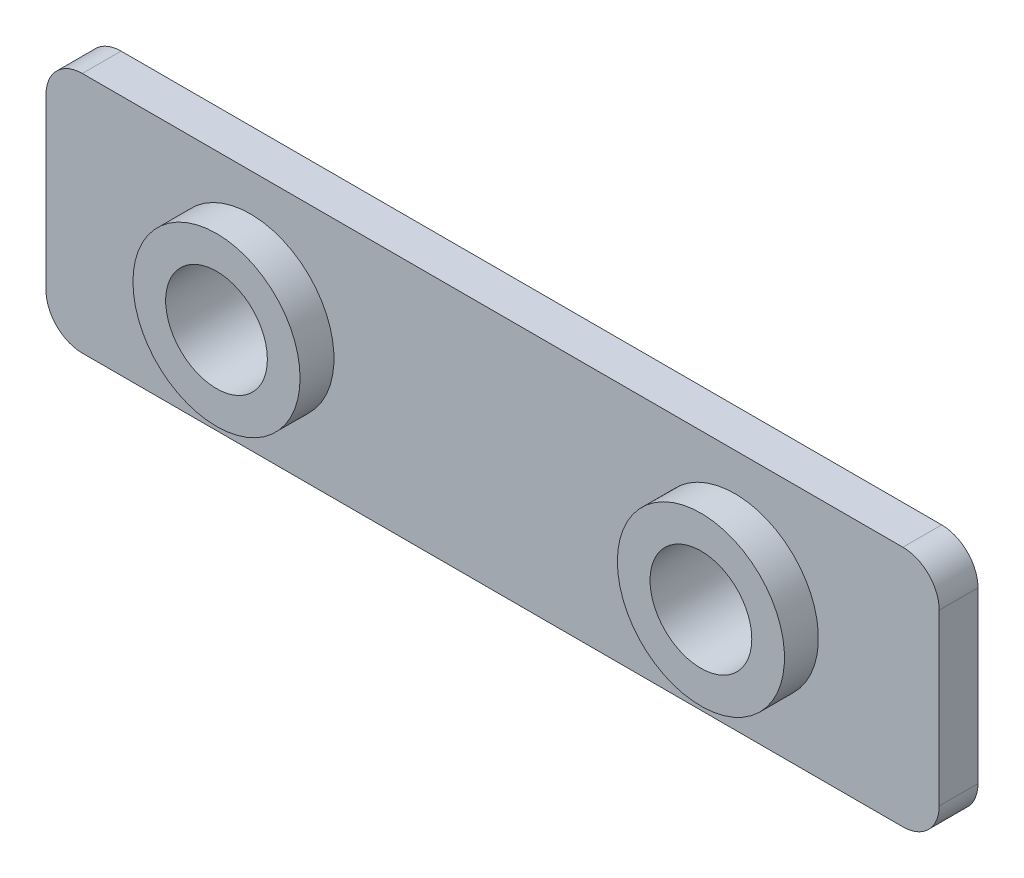
ISO-10303-21;
HEADER;
FILE_DESCRIPTION(('STEP AP214'),'2;1');
FILE_NAME('part.step','',(''),(''),'','','');
FILE_SCHEMA(('AUTOMOTIVE_DESIGN { 1 0 10303 214 1 1 1 1 }'));
ENDSEC;
DATA;
#1=APPLICATION_CONTEXT('core data for automotive mechanical design processes');
#2=APPLICATION_PROTOCOL_DEFINITION('international standard','automotive_design',2000,#1);
#3=PRODUCT_CONTEXT('',#1,'mechanical');
#4=PRODUCT('Part','Part','',(#3));
#5=PRODUCT_RELATED_PRODUCT_CATEGORY('part','',(#4));
#6=PRODUCT_DEFINITION_FORMATION('','',#4);
#7=PRODUCT_DEFINITION_CONTEXT('part definition',#1,'design');
#8=PRODUCT_DEFINITION('design','',#6,#7);
#9=PRODUCT_DEFINITION_SHAPE('','',#8);
#10=(LENGTH_UNIT() NAMED_UNIT(*) SI_UNIT(.MILLI.,.METRE.));
#11=(NAMED_UNIT(*) PLANE_ANGLE_UNIT() SI_UNIT($,.RADIAN.));
#12=(NAMED_UNIT(*) SI_UNIT($,.STERADIAN.) SOLID_ANGLE_UNIT());
#13=UNCERTAINTY_MEASURE_WITH_UNIT(LENGTH_MEASURE(1.E-05),#10,'distance_accuracy_value','');
#14=(GEOMETRIC_REPRESENTATION_CONTEXT(3) GLOBAL_UNCERTAINTY_ASSIGNED_CONTEXT((#13)) GLOBAL_UNIT_ASSIGNED_CONTEXT((#10,
#11,#12)) REPRESENTATION_CONTEXT('',''));
#15=CARTESIAN_POINT('',(0.,0.,0.));
#16=DIRECTION('',(0.,0.,1.));
#17=DIRECTION('',(1.,0.,0.));
#18=AXIS2_PLACEMENT_3D('',#15,#16,#17);
#19=CARTESIAN_POINT('',(35.38,8.5,1.6));
#20=DIRECTION('',(0.,0.,-1.));
#21=DIRECTION('',(-1.,0.,0.));
#22=AXIS2_PLACEMENT_3D('',#19,#20,#21);
#23=PLANE('',#22);
#24=CARTESIAN_POINT('',(35.38,8.5,1.6));
#25=DIRECTION('',(0.,0.,1.));
#26=DIRECTION('',(-1.,0.,0.));
#27=AXIS2_PLACEMENT_3D('',#24,#25,#26);
#28=CIRCLE('',#27,1.5);
#29=CARTESIAN_POINT('',(36.88,8.49999999999999,1.6));
#30=VERTEX_POINT('',#29);
#31=CARTESIAN_POINT('',(35.38,10.,1.6));
#32=VERTEX_POINT('',#31);
#33=EDGE_CURVE('E222',#30,#32,#28,.T.);
#34=ORIENTED_EDGE('',*,*,#33,.T.);
#35=DIRECTION('',(-1.,0.,0.));
#36=VECTOR('',#35,1.);
#37=CARTESIAN_POINT('',(1.50000000000001,10.,1.6));
#38=LINE('',#37,#36);
#39=CARTESIAN_POINT('',(1.50000000000001,10.,1.6));
#40=VERTEX_POINT('',#39);
#41=EDGE_CURVE('E121',#32,#40,#38,.T.);
#42=ORIENTED_EDGE('',*,*,#41,.T.);
#43=CARTESIAN_POINT('',(1.5,8.5,1.6));
#44=DIRECTION('',(0.,0.,1.));
#45=DIRECTION('',(-1.,0.,0.));
#46=AXIS2_PLACEMENT_3D('',#43,#44,#45);
#47=CIRCLE('',#46,1.5);
#48=CARTESIAN_POINT('',(0.,8.49999999999999,1.6));
#49=VERTEX_POINT('',#48);
#50=EDGE_CURVE('E221',#40,#49,#47,.T.);
#51=ORIENTED_EDGE('',*,*,#50,.T.);
#52=DIRECTION('',(0.,-1.,0.));
#53=VECTOR('',#52,1.);
#54=CARTESIAN_POINT('',(0.,1.50000000000001,1.6));
#55=LINE('',#54,#53);
#56=CARTESIAN_POINT('',(0.,1.50000000000001,1.6));
#57=VERTEX_POINT('',#56);
#58=EDGE_CURVE('E228',#49,#57,#55,.T.);
#59=ORIENTED_EDGE('',*,*,#58,.T.);
#60=CARTESIAN_POINT('',(1.5,1.5,1.6));
#61=DIRECTION('',(0.,0.,1.));
#62=DIRECTION('',(-1.,0.,0.));
#63=AXIS2_PLACEMENT_3D('',#60,#61,#62);
#64=CIRCLE('',#63,1.5);
#65=CARTESIAN_POINT('',(1.50000000000001,0.,1.6));
#66=VERTEX_POINT('',#65);
#67=EDGE_CURVE('E144',#57,#66,#64,.T.);
#68=ORIENTED_EDGE('',*,*,#67,.T.);
#69=DIRECTION('',(1.,0.,0.));
#70=VECTOR('',#69,1.);
#71=CARTESIAN_POINT('',(1.50000000000001,0.,1.6));
#72=LINE('',#71,#70);
#73=CARTESIAN_POINT('',(35.38,0.,1.6));
#74=VERTEX_POINT('',#73);
#75=EDGE_CURVE('E138',#66,#74,#72,.T.);
#76=ORIENTED_EDGE('',*,*,#75,.T.);
#77=CARTESIAN_POINT('',(35.38,1.5,1.6));
#78=DIRECTION('',(0.,0.,1.));
#79=DIRECTION('',(1.,0.,0.));
#80=AXIS2_PLACEMENT_3D('',#77,#78,#79);
#81=CIRCLE('',#80,1.5);
#82=CARTESIAN_POINT('',(36.88,1.50000000000001,1.6));
#83=VERTEX_POINT('',#82);
#84=EDGE_CURVE('E142',#74,#83,#81,.T.);
#85=ORIENTED_EDGE('',*,*,#84,.T.);
#86=DIRECTION('',(0.,1.,0.));
#87=VECTOR('',#86,1.);
#88=CARTESIAN_POINT('',(36.88,1.50000000000001,1.6));
#89=LINE('',#88,#87);
#90=EDGE_CURVE('E68',#83,#30,#89,.T.);
#91=ORIENTED_EDGE('',*,*,#90,.T.);
#92=EDGE_LOOP('',(#34,#42,#51,#59,#68,#76,#85,#91));
#93=FACE_BOUND('',#92,.T.);
#94=CARTESIAN_POINT('',(8.44,5.,1.6));
#95=DIRECTION('',(0.,0.,-1.));
#96=DIRECTION('',(-1.,0.,0.));
#97=AXIS2_PLACEMENT_3D('',#94,#95,#96);
#98=CIRCLE('',#97,3.45);
#99=CARTESIAN_POINT('',(4.99,5.,1.6));
#100=VERTEX_POINT('',#99);
#101=EDGE_CURVE('E57',#100,#100,#98,.F.);
#102=ORIENTED_EDGE('',*,*,#101,.F.);
#103=EDGE_LOOP('',(#102));
#104=FACE_BOUND('',#103,.T.);
#105=CARTESIAN_POINT('',(28.44,5.,1.6));
#106=DIRECTION('',(0.,0.,-1.));
#107=DIRECTION('',(-1.,0.,0.));
#108=AXIS2_PLACEMENT_3D('',#105,#106,#107);
#109=CIRCLE('',#108,3.45);
#110=CARTESIAN_POINT('',(24.99,5.,1.6));
#111=VERTEX_POINT('',#110);
#112=EDGE_CURVE('E12',#111,#111,#109,.F.);
#113=ORIENTED_EDGE('',*,*,#112,.F.);
#114=EDGE_LOOP('',(#113));
#115=FACE_BOUND('',#114,.T.);
#116=ADVANCED_FACE('F46',(#93,#104,#115),#23,.F.);
#117=CARTESIAN_POINT('',(35.38,8.5,1.6));
#118=DIRECTION('',(0.,0.,-1.));
#119=DIRECTION('',(-1.,0.,0.));
#120=AXIS2_PLACEMENT_3D('',#117,#118,#119);
#121=CYLINDRICAL_SURFACE('',#120,1.5);
#122=CARTESIAN_POINT('',(35.38,8.5,0.));
#123=DIRECTION('',(0.,0.,1.));
#124=DIRECTION('',(-1.,0.,0.));
#125=AXIS2_PLACEMENT_3D('',#122,#123,#124);
#126=CIRCLE('',#125,1.5);
#127=CARTESIAN_POINT('',(36.88,8.49999999999999,0.));
#128=VERTEX_POINT('',#127);
#129=CARTESIAN_POINT('',(35.38,10.,0.));
#130=VERTEX_POINT('',#129);
#131=EDGE_CURVE('E270',#128,#130,#126,.T.);
#132=ORIENTED_EDGE('',*,*,#131,.T.);
#133=DIRECTION('',(0.,0.,-1.));
#134=VECTOR('',#133,1.);
#135=CARTESIAN_POINT('',(35.38,10.,1.6));
#136=LINE('',#135,#134);
#137=EDGE_CURVE('E194',#32,#130,#136,.T.);
#138=ORIENTED_EDGE('',*,*,#137,.F.);
#139=ORIENTED_EDGE('',*,*,#33,.F.);
#140=DIRECTION('',(0.,0.,-1.));
#141=VECTOR('',#140,1.);
#142=CARTESIAN_POINT('',(36.88,8.49999999999999,1.6));
#143=LINE('',#142,#141);
#144=EDGE_CURVE('E162',#30,#128,#143,.T.);
#145=ORIENTED_EDGE('',*,*,#144,.T.);
#146=EDGE_LOOP('',(#132,#138,#139,#145));
#147=FACE_BOUND('',#146,.T.);
#148=ADVANCED_FACE('F49',(#147),#121,.T.);
#149=CARTESIAN_POINT('',(1.50000000000001,10.,1.6));
#150=DIRECTION('',(0.,-1.,0.));
#151=DIRECTION('',(0.,0.,-1.));
#152=AXIS2_PLACEMENT_3D('',#149,#150,#151);
#153=PLANE('',#152);
#154=DIRECTION('',(-1.,0.,0.));
#155=VECTOR('',#154,1.);
#156=CARTESIAN_POINT('',(1.50000000000001,10.,0.));
#157=LINE('',#156,#155);
#158=CARTESIAN_POINT('',(1.50000000000001,10.,0.));
#159=VERTEX_POINT('',#158);
#160=EDGE_CURVE('E263',#130,#159,#157,.T.);
#161=ORIENTED_EDGE('',*,*,#160,.T.);
#162=DIRECTION('',(0.,0.,-1.));
#163=VECTOR('',#162,1.);
#164=CARTESIAN_POINT('',(1.50000000000001,10.,1.6));
#165=LINE('',#164,#163);
#166=EDGE_CURVE('E189',#40,#159,#165,.T.);
#167=ORIENTED_EDGE('',*,*,#166,.F.);
#168=ORIENTED_EDGE('',*,*,#41,.F.);
#169=ORIENTED_EDGE('',*,*,#137,.T.);
#170=EDGE_LOOP('',(#161,#167,#168,#169));
#171=FACE_BOUND('',#170,.T.);
#172=ADVANCED_FACE('F293',(#171),#153,.F.);
#173=CARTESIAN_POINT('',(1.5,8.5,1.6));
#174=DIRECTION('',(0.,0.,-1.));
#175=DIRECTION('',(-1.,0.,0.));
#176=AXIS2_PLACEMENT_3D('',#173,#174,#175);
#177=CYLINDRICAL_SURFACE('',#176,1.5);
#178=CARTESIAN_POINT('',(1.5,8.5,0.));
#179=DIRECTION('',(0.,0.,1.));
#180=DIRECTION('',(-1.,0.,0.));
#181=AXIS2_PLACEMENT_3D('',#178,#179,#180);
#182=CIRCLE('',#181,1.5);
#183=CARTESIAN_POINT('',(0.,8.49999999999999,0.));
#184=VERTEX_POINT('',#183);
#185=EDGE_CURVE('E259',#159,#184,#182,.T.);
#186=ORIENTED_EDGE('',*,*,#185,.T.);
#187=DIRECTION('',(0.,0.,-1.));
#188=VECTOR('',#187,1.);
#189=CARTESIAN_POINT('',(0.,8.49999999999999,1.6));
#190=LINE('',#189,#188);
#191=EDGE_CURVE('E183',#49,#184,#190,.T.);
#192=ORIENTED_EDGE('',*,*,#191,.F.);
#193=ORIENTED_EDGE('',*,*,#50,.F.);
#194=ORIENTED_EDGE('',*,*,#166,.T.);
#195=EDGE_LOOP('',(#186,#192,#193,#194));
#196=FACE_BOUND('',#195,.T.);
#197=ADVANCED_FACE('F298',(#196),#177,.T.);
#198=CARTESIAN_POINT('',(0.,1.50000000000001,1.6));
#199=DIRECTION('',(1.,0.,0.));
#200=DIRECTION('',(0.,0.,-1.));
#201=AXIS2_PLACEMENT_3D('',#198,#199,#200);
#202=PLANE('',#201);
#203=DIRECTION('',(0.,-1.,0.));
#204=VECTOR('',#203,1.);
#205=CARTESIAN_POINT('',(0.,1.50000000000001,0.));
#206=LINE('',#205,#204);
#207=CARTESIAN_POINT('',(0.,1.50000000000001,0.));
#208=VERTEX_POINT('',#207);
#209=EDGE_CURVE('E255',#184,#208,#206,.T.);
#210=ORIENTED_EDGE('',*,*,#209,.T.);
#211=DIRECTION('',(0.,0.,-1.));
#212=VECTOR('',#211,1.);
#213=CARTESIAN_POINT('',(0.,1.50000000000001,1.6));
#214=LINE('',#213,#212);
#215=EDGE_CURVE('E178',#57,#208,#214,.T.);
#216=ORIENTED_EDGE('',*,*,#215,.F.);
#217=ORIENTED_EDGE('',*,*,#58,.F.);
#218=ORIENTED_EDGE('',*,*,#191,.T.);
#219=EDGE_LOOP('',(#210,#216,#217,#218));
#220=FACE_BOUND('',#219,.T.);
#221=ADVANCED_FACE('F305',(#220),#202,.F.);
#222=CARTESIAN_POINT('',(1.5,1.5,1.6));
#223=DIRECTION('',(0.,0.,-1.));
#224=DIRECTION('',(-1.,0.,0.));
#225=AXIS2_PLACEMENT_3D('',#222,#223,#224);
#226=CYLINDRICAL_SURFACE('',#225,1.5);
#227=CARTESIAN_POINT('',(1.5,1.5,0.));
#228=DIRECTION('',(0.,0.,1.));
#229=DIRECTION('',(-1.,0.,0.));
#230=AXIS2_PLACEMENT_3D('',#227,#228,#229);
#231=CIRCLE('',#230,1.5);
#232=CARTESIAN_POINT('',(1.50000000000001,0.,0.));
#233=VERTEX_POINT('',#232);
#234=EDGE_CURVE('E240',#208,#233,#231,.T.);
#235=ORIENTED_EDGE('',*,*,#234,.T.);
#236=DIRECTION('',(0.,0.,-1.));
#237=VECTOR('',#236,1.);
#238=CARTESIAN_POINT('',(1.50000000000001,0.,1.6));
#239=LINE('',#238,#237);
#240=EDGE_CURVE('E155',#66,#233,#239,.T.);
#241=ORIENTED_EDGE('',*,*,#240,.F.);
#242=ORIENTED_EDGE('',*,*,#67,.F.);
#243=ORIENTED_EDGE('',*,*,#215,.T.);
#244=EDGE_LOOP('',(#235,#241,#242,#243));
#245=FACE_BOUND('',#244,.T.);
#246=ADVANCED_FACE('F308',(#245),#226,.T.);
#247=CARTESIAN_POINT('',(1.50000000000001,0.,1.6));
#248=DIRECTION('',(0.,1.,0.));
#249=DIRECTION('',(0.,0.,1.));
#250=AXIS2_PLACEMENT_3D('',#247,#248,#249);
#251=PLANE('',#250);
#252=DIRECTION('',(1.,0.,0.));
#253=VECTOR('',#252,1.);
#254=CARTESIAN_POINT('',(1.50000000000001,0.,0.));
#255=LINE('',#254,#253);
#256=CARTESIAN_POINT('',(35.38,0.,0.));
#257=VERTEX_POINT('',#256);
#258=EDGE_CURVE('E153',#233,#257,#255,.T.);
#259=ORIENTED_EDGE('',*,*,#258,.T.);
#260=DIRECTION('',(0.,0.,-1.));
#261=VECTOR('',#260,1.);
#262=CARTESIAN_POINT('',(35.38,0.,1.6));
#263=LINE('',#262,#261);
#264=EDGE_CURVE('E150',#74,#257,#263,.T.);
#265=ORIENTED_EDGE('',*,*,#264,.F.);
#266=ORIENTED_EDGE('',*,*,#75,.F.);
#267=ORIENTED_EDGE('',*,*,#240,.T.);
#268=EDGE_LOOP('',(#259,#265,#266,#267));
#269=FACE_BOUND('',#268,.T.);
#270=ADVANCED_FACE('F151',(#269),#251,.F.);
#271=CARTESIAN_POINT('',(35.38,1.5,1.6));
#272=DIRECTION('',(0.,0.,-1.));
#273=DIRECTION('',(-1.,0.,0.));
#274=AXIS2_PLACEMENT_3D('',#271,#272,#273);
#275=CYLINDRICAL_SURFACE('',#274,1.5);
#276=CARTESIAN_POINT('',(35.38,1.5,0.));
#277=DIRECTION('',(0.,0.,1.));
#278=DIRECTION('',(1.,0.,0.));
#279=AXIS2_PLACEMENT_3D('',#276,#277,#278);
#280=CIRCLE('',#279,1.5);
#281=CARTESIAN_POINT('',(36.88,1.50000000000001,0.));
#282=VERTEX_POINT('',#281);
#283=EDGE_CURVE('E105',#257,#282,#280,.T.);
#284=ORIENTED_EDGE('',*,*,#283,.T.);
#285=DIRECTION('',(0.,0.,-1.));
#286=VECTOR('',#285,1.);
#287=CARTESIAN_POINT('',(36.88,1.50000000000001,1.6));
#288=LINE('',#287,#286);
#289=EDGE_CURVE('E156',#83,#282,#288,.T.);
#290=ORIENTED_EDGE('',*,*,#289,.F.);
#291=ORIENTED_EDGE('',*,*,#84,.F.);
#292=ORIENTED_EDGE('',*,*,#264,.T.);
#293=EDGE_LOOP('',(#284,#290,#291,#292));
#294=FACE_BOUND('',#293,.T.);
#295=ADVANCED_FACE('F158',(#294),#275,.T.);
#296=CARTESIAN_POINT('',(36.88,1.50000000000001,1.6));
#297=DIRECTION('',(-1.,0.,0.));
#298=DIRECTION('',(0.,0.,1.));
#299=AXIS2_PLACEMENT_3D('',#296,#297,#298);
#300=PLANE('',#299);
#301=DIRECTION('',(0.,1.,0.));
#302=VECTOR('',#301,1.);
#303=CARTESIAN_POINT('',(36.88,1.50000000000001,0.));
#304=LINE('',#303,#302);
#305=EDGE_CURVE('E112',#282,#128,#304,.T.);
#306=ORIENTED_EDGE('',*,*,#305,.T.);
#307=ORIENTED_EDGE('',*,*,#144,.F.);
#308=ORIENTED_EDGE('',*,*,#90,.F.);
#309=ORIENTED_EDGE('',*,*,#289,.T.);
#310=EDGE_LOOP('',(#306,#307,#308,#309));
#311=FACE_BOUND('',#310,.T.);
#312=ADVANCED_FACE('F334',(#311),#300,.F.);
#313=CARTESIAN_POINT('',(35.38,8.5,0.));
#314=DIRECTION('',(0.,0.,-1.));
#315=DIRECTION('',(-1.,0.,0.));
#316=AXIS2_PLACEMENT_3D('',#313,#314,#315);
#317=PLANE('',#316);
#318=CARTESIAN_POINT('',(8.44,5.,0.));
#319=DIRECTION('',(0.,0.,1.));
#320=DIRECTION('',(1.,0.,0.));
#321=AXIS2_PLACEMENT_3D('',#318,#319,#320);
#322=CIRCLE('',#321,2.1);
#323=CARTESIAN_POINT('',(10.54,5.,0.));
#324=VERTEX_POINT('',#323);
#325=EDGE_CURVE('E484',#324,#324,#322,.T.);
#326=ORIENTED_EDGE('',*,*,#325,.T.);
#327=EDGE_LOOP('',(#326));
#328=FACE_BOUND('',#327,.T.);
#329=CARTESIAN_POINT('',(28.44,5.,0.));
#330=DIRECTION('',(0.,0.,1.));
#331=DIRECTION('',(1.,0.,0.));
#332=AXIS2_PLACEMENT_3D('',#329,#330,#331);
#333=CIRCLE('',#332,2.1);
#334=CARTESIAN_POINT('',(30.54,5.,0.));
#335=VERTEX_POINT('',#334);
#336=EDGE_CURVE('E276',#335,#335,#333,.T.);
#337=ORIENTED_EDGE('',*,*,#336,.T.);
#338=EDGE_LOOP('',(#337));
#339=FACE_BOUND('',#338,.T.);
#340=ORIENTED_EDGE('',*,*,#131,.F.);
#341=ORIENTED_EDGE('',*,*,#305,.F.);
#342=ORIENTED_EDGE('',*,*,#283,.F.);
#343=ORIENTED_EDGE('',*,*,#258,.F.);
#344=ORIENTED_EDGE('',*,*,#234,.F.);
#345=ORIENTED_EDGE('',*,*,#209,.F.);
#346=ORIENTED_EDGE('',*,*,#185,.F.);
#347=ORIENTED_EDGE('',*,*,#160,.F.);
#348=EDGE_LOOP('',(#340,#341,#342,#343,#344,#345,#346,#347));
#349=FACE_BOUND('',#348,.T.);
#350=ADVANCED_FACE('F301',(#328,#339,#349),#317,.T.);
#351=CARTESIAN_POINT('',(8.44,5.,3.));
#352=DIRECTION('',(0.,0.,-1.));
#353=DIRECTION('',(-1.,0.,0.));
#354=AXIS2_PLACEMENT_3D('',#351,#352,#353);
#355=CYLINDRICAL_SURFACE('',#354,3.45);
#356=CARTESIAN_POINT('',(8.44,5.,3.));
#357=DIRECTION('',(0.,0.,1.));
#358=DIRECTION('',(1.,0.,0.));
#359=AXIS2_PLACEMENT_3D('',#356,#357,#358);
#360=CIRCLE('',#359,3.45);
#361=CARTESIAN_POINT('',(11.89,5.,3.));
#362=VERTEX_POINT('',#361);
#363=EDGE_CURVE('E267',#362,#362,#360,.T.);
#364=ORIENTED_EDGE('',*,*,#363,.F.);
#365=EDGE_LOOP('',(#364));
#366=FACE_BOUND('',#365,.T.);
#367=ORIENTED_EDGE('',*,*,#101,.T.);
#368=EDGE_LOOP('',(#367));
#369=FACE_BOUND('',#368,.T.);
#370=ADVANCED_FACE('F329',(#366,#369),#355,.T.);
#371=CARTESIAN_POINT('',(8.44,5.,3.));
#372=DIRECTION('',(0.,0.,1.));
#373=DIRECTION('',(1.,0.,0.));
#374=AXIS2_PLACEMENT_3D('',#371,#372,#373);
#375=PLANE('',#374);
#376=CARTESIAN_POINT('',(8.44,5.,3.));
#377=DIRECTION('',(0.,0.,1.));
#378=DIRECTION('',(1.,0.,0.));
#379=AXIS2_PLACEMENT_3D('',#376,#377,#378);
#380=CIRCLE('',#379,2.09999999999999);
#381=CARTESIAN_POINT('',(10.54,5.,3.));
#382=VERTEX_POINT('',#381);
#383=EDGE_CURVE('E487',#382,#382,#380,.T.);
#384=ORIENTED_EDGE('',*,*,#383,.F.);
#385=EDGE_LOOP('',(#384));
#386=FACE_BOUND('',#385,.T.);
#387=ORIENTED_EDGE('',*,*,#363,.T.);
#388=EDGE_LOOP('',(#387));
#389=FACE_BOUND('',#388,.T.);
#390=ADVANCED_FACE('F388',(#386,#389),#375,.T.);
#391=CARTESIAN_POINT('',(28.44,5.,3.));
#392=DIRECTION('',(0.,0.,-1.));
#393=DIRECTION('',(-1.,0.,0.));
#394=AXIS2_PLACEMENT_3D('',#391,#392,#393);
#395=CYLINDRICAL_SURFACE('',#394,3.45);
#396=CARTESIAN_POINT('',(28.44,5.,3.));
#397=DIRECTION('',(0.,0.,1.));
#398=DIRECTION('',(-1.,0.,0.));
#399=AXIS2_PLACEMENT_3D('',#396,#397,#398);
#400=CIRCLE('',#399,3.45);
#401=CARTESIAN_POINT('',(24.99,5.,3.));
#402=VERTEX_POINT('',#401);
#403=EDGE_CURVE('E271',#402,#402,#400,.T.);
#404=ORIENTED_EDGE('',*,*,#403,.F.);
#405=EDGE_LOOP('',(#404));
#406=FACE_BOUND('',#405,.T.);
#407=ORIENTED_EDGE('',*,*,#112,.T.);
#408=EDGE_LOOP('',(#407));
#409=FACE_BOUND('',#408,.T.);
#410=ADVANCED_FACE('F395',(#406,#409),#395,.T.);
#411=CARTESIAN_POINT('',(28.44,5.,3.));
#412=DIRECTION('',(0.,0.,-1.));
#413=DIRECTION('',(-1.,0.,0.));
#414=AXIS2_PLACEMENT_3D('',#411,#412,#413);
#415=PLANE('',#414);
#416=CARTESIAN_POINT('',(28.44,5.,3.));
#417=DIRECTION('',(0.,0.,1.));
#418=DIRECTION('',(1.,0.,0.));
#419=AXIS2_PLACEMENT_3D('',#416,#417,#418);
#420=CIRCLE('',#419,2.09999999999999);
#421=CARTESIAN_POINT('',(30.54,5.,3.));
#422=VERTEX_POINT('',#421);
#423=EDGE_CURVE('E281',#422,#422,#420,.T.);
#424=ORIENTED_EDGE('',*,*,#423,.F.);
#425=EDGE_LOOP('',(#424));
#426=FACE_BOUND('',#425,.T.);
#427=ORIENTED_EDGE('',*,*,#403,.T.);
#428=EDGE_LOOP('',(#427));
#429=FACE_BOUND('',#428,.T.);
#430=ADVANCED_FACE('F403',(#426,#429),#415,.F.);
#431=CARTESIAN_POINT('',(28.44,5.,3.));
#432=DIRECTION('',(0.,0.,1.));
#433=DIRECTION('',(1.,0.,0.));
#434=AXIS2_PLACEMENT_3D('',#431,#432,#433);
#435=CYLINDRICAL_SURFACE('',#434,2.09999999999999);
#436=ORIENTED_EDGE('',*,*,#336,.F.);
#437=EDGE_LOOP('',(#436));
#438=FACE_BOUND('',#437,.T.);
#439=ORIENTED_EDGE('',*,*,#423,.T.);
#440=EDGE_LOOP('',(#439));
#441=FACE_BOUND('',#440,.T.);
#442=ADVANCED_FACE('F411',(#438,#441),#435,.F.);
#443=CARTESIAN_POINT('',(8.44,5.,3.));
#444=DIRECTION('',(0.,0.,1.));
#445=DIRECTION('',(1.,0.,0.));
#446=AXIS2_PLACEMENT_3D('',#443,#444,#445);
#447=CYLINDRICAL_SURFACE('',#446,2.09999999999999);
#448=ORIENTED_EDGE('',*,*,#325,.F.);
#449=EDGE_LOOP('',(#448));
#450=FACE_BOUND('',#449,.T.);
#451=ORIENTED_EDGE('',*,*,#383,.T.);
#452=EDGE_LOOP('',(#451));
#453=FACE_BOUND('',#452,.T.);
#454=ADVANCED_FACE('F420',(#450,#453),#447,.F.);
#455=CLOSED_SHELL('',(#116,#148,#172,#197,#221,#246,#270,#295,#312,#350,#370,#390,#410,#430,
#442,#454));
#456=MANIFOLD_SOLID_BREP('B2',#455);
#457=ADVANCED_BREP_SHAPE_REPRESENTATION('',(#18,#456),#14);
#458=SHAPE_DEFINITION_REPRESENTATION(#9,#457);
ENDSEC;
END-ISO-10303-21;
